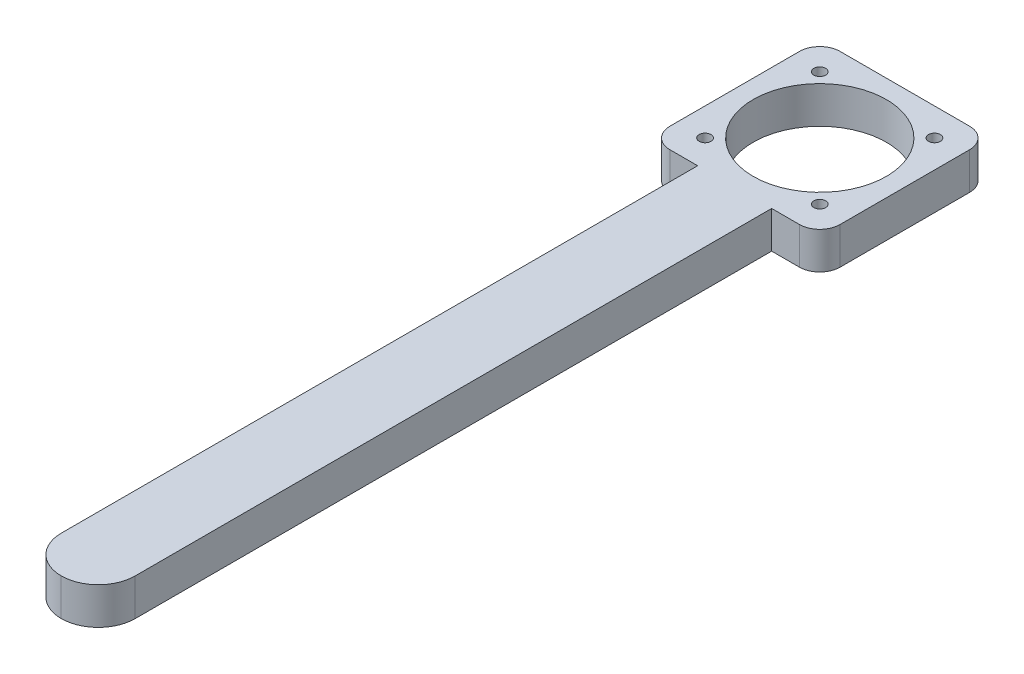
ISO-10303-21;
HEADER;
FILE_DESCRIPTION(('STEP AP214'),'2;1');
FILE_NAME('part.step','',(''),(''),'','','');
FILE_SCHEMA(('AUTOMOTIVE_DESIGN { 1 0 10303 214 1 1 1 1 }'));
ENDSEC;
DATA;
#1=APPLICATION_CONTEXT('core data for automotive mechanical design processes');
#2=APPLICATION_PROTOCOL_DEFINITION('international standard','automotive_design',2000,#1);
#3=PRODUCT_CONTEXT('',#1,'mechanical');
#4=PRODUCT('Part','Part','',(#3));
#5=PRODUCT_RELATED_PRODUCT_CATEGORY('part','',(#4));
#6=PRODUCT_DEFINITION_FORMATION('','',#4);
#7=PRODUCT_DEFINITION_CONTEXT('part definition',#1,'design');
#8=PRODUCT_DEFINITION('design','',#6,#7);
#9=PRODUCT_DEFINITION_SHAPE('','',#8);
#10=(LENGTH_UNIT() NAMED_UNIT(*) SI_UNIT(.MILLI.,.METRE.));
#11=(NAMED_UNIT(*) PLANE_ANGLE_UNIT() SI_UNIT($,.RADIAN.));
#12=(NAMED_UNIT(*) SI_UNIT($,.STERADIAN.) SOLID_ANGLE_UNIT());
#13=UNCERTAINTY_MEASURE_WITH_UNIT(LENGTH_MEASURE(1.E-05),#10,'distance_accuracy_value','');
#14=(GEOMETRIC_REPRESENTATION_CONTEXT(3) GLOBAL_UNCERTAINTY_ASSIGNED_CONTEXT((#13)) GLOBAL_UNIT_ASSIGNED_CONTEXT((#10,
#11,#12)) REPRESENTATION_CONTEXT('',''));
#15=CARTESIAN_POINT('',(0.,0.,0.));
#16=DIRECTION('',(0.,0.,1.));
#17=DIRECTION('',(1.,0.,0.));
#18=AXIS2_PLACEMENT_3D('',#15,#16,#17);
#19=CARTESIAN_POINT('',(-23.,10.,23.));
#20=DIRECTION('',(0.,0.,-1.));
#21=DIRECTION('',(-1.,0.,0.));
#22=AXIS2_PLACEMENT_3D('',#19,#20,#21);
#23=PLANE('',#22);
#24=DIRECTION('',(1.,0.,0.));
#25=VECTOR('',#24,1.);
#26=CARTESIAN_POINT('',(-23.,10.,23.));
#27=LINE('',#26,#25);
#28=CARTESIAN_POINT('',(10.,10.,23.));
#29=VERTEX_POINT('',#28);
#30=CARTESIAN_POINT('',(17.5,10.,23.));
#31=VERTEX_POINT('',#30);
#32=EDGE_CURVE('E249',#29,#31,#27,.T.);
#33=ORIENTED_EDGE('',*,*,#32,.F.);
#34=DIRECTION('',(0.,1.,0.));
#35=VECTOR('',#34,1.);
#36=CARTESIAN_POINT('',(10.,0.,23.));
#37=LINE('',#36,#35);
#38=CARTESIAN_POINT('',(10.,0.,23.));
#39=VERTEX_POINT('',#38);
#40=EDGE_CURVE('E154',#39,#29,#37,.T.);
#41=ORIENTED_EDGE('',*,*,#40,.F.);
#42=DIRECTION('',(1.,0.,0.));
#43=VECTOR('',#42,1.);
#44=CARTESIAN_POINT('',(-23.,0.,23.));
#45=LINE('',#44,#43);
#46=CARTESIAN_POINT('',(17.5,0.,23.));
#47=VERTEX_POINT('',#46);
#48=EDGE_CURVE('E171',#39,#47,#45,.T.);
#49=ORIENTED_EDGE('',*,*,#48,.T.);
#50=DIRECTION('',(0.,-1.,0.));
#51=VECTOR('',#50,1.);
#52=CARTESIAN_POINT('',(17.5,10.,23.));
#53=LINE('',#52,#51);
#54=EDGE_CURVE('E205',#47,#31,#53,.F.);
#55=ORIENTED_EDGE('',*,*,#54,.T.);
#56=EDGE_LOOP('',(#33,#41,#49,#55));
#57=FACE_BOUND('',#56,.T.);
#58=ADVANCED_FACE('F45',(#57),#23,.F.);
#59=CARTESIAN_POINT('',(0.,10.,0.));
#60=DIRECTION('',(0.,-1.,0.));
#61=DIRECTION('',(0.,0.,-1.));
#62=AXIS2_PLACEMENT_3D('',#59,#60,#61);
#63=PLANE('',#62);
#64=CARTESIAN_POINT('',(15.5,10.,15.5));
#65=DIRECTION('',(0.,1.,0.));
#66=DIRECTION('',(0.,0.,1.));
#67=AXIS2_PLACEMENT_3D('',#64,#65,#66);
#68=CIRCLE('',#67,1.6);
#69=CARTESIAN_POINT('',(15.5,10.,17.1));
#70=VERTEX_POINT('',#69);
#71=EDGE_CURVE('E373',#70,#70,#68,.T.);
#72=ORIENTED_EDGE('',*,*,#71,.F.);
#73=EDGE_LOOP('',(#72));
#74=FACE_BOUND('',#73,.T.);
#75=CARTESIAN_POINT('',(15.5,10.,-15.5));
#76=DIRECTION('',(0.,1.,0.));
#77=DIRECTION('',(0.,0.,1.));
#78=AXIS2_PLACEMENT_3D('',#75,#76,#77);
#79=CIRCLE('',#78,1.6);
#80=CARTESIAN_POINT('',(15.5,10.,-13.9));
#81=VERTEX_POINT('',#80);
#82=EDGE_CURVE('E379',#81,#81,#79,.T.);
#83=ORIENTED_EDGE('',*,*,#82,.F.);
#84=EDGE_LOOP('',(#83));
#85=FACE_BOUND('',#84,.T.);
#86=CARTESIAN_POINT('',(-15.5,10.,-15.5));
#87=DIRECTION('',(0.,1.,0.));
#88=DIRECTION('',(0.,0.,1.));
#89=AXIS2_PLACEMENT_3D('',#86,#87,#88);
#90=CIRCLE('',#89,1.6);
#91=CARTESIAN_POINT('',(-15.5,10.,-13.9));
#92=VERTEX_POINT('',#91);
#93=EDGE_CURVE('E365',#92,#92,#90,.T.);
#94=ORIENTED_EDGE('',*,*,#93,.F.);
#95=EDGE_LOOP('',(#94));
#96=FACE_BOUND('',#95,.T.);
#97=CARTESIAN_POINT('',(-15.5,10.,15.5));
#98=DIRECTION('',(0.,1.,0.));
#99=DIRECTION('',(0.,0.,1.));
#100=AXIS2_PLACEMENT_3D('',#97,#98,#99);
#101=CIRCLE('',#100,1.6);
#102=CARTESIAN_POINT('',(-15.5,10.,17.1));
#103=VERTEX_POINT('',#102);
#104=EDGE_CURVE('E359',#103,#103,#101,.T.);
#105=ORIENTED_EDGE('',*,*,#104,.F.);
#106=EDGE_LOOP('',(#105));
#107=FACE_BOUND('',#106,.T.);
#108=DIRECTION('',(0.,0.,1.));
#109=VECTOR('',#108,1.);
#110=CARTESIAN_POINT('',(-10.,10.,23.));
#111=LINE('',#110,#109);
#112=CARTESIAN_POINT('',(-10.,10.,23.));
#113=VERTEX_POINT('',#112);
#114=CARTESIAN_POINT('',(-10.,10.,195.));
#115=VERTEX_POINT('',#114);
#116=EDGE_CURVE('E148',#113,#115,#111,.T.);
#117=ORIENTED_EDGE('',*,*,#116,.T.);
#118=CARTESIAN_POINT('',(0.,10.,195.));
#119=DIRECTION('',(0.,-1.,0.));
#120=DIRECTION('',(0.,0.,-1.));
#121=AXIS2_PLACEMENT_3D('',#118,#119,#120);
#122=CIRCLE('',#121,10.);
#123=CARTESIAN_POINT('',(0.,10.,205.));
#124=VERTEX_POINT('',#123);
#125=EDGE_CURVE('E241',#115,#124,#122,.F.);
#126=ORIENTED_EDGE('',*,*,#125,.T.);
#127=CARTESIAN_POINT('',(0.,10.,195.));
#128=DIRECTION('',(0.,-1.,0.));
#129=DIRECTION('',(0.,0.,-1.));
#130=AXIS2_PLACEMENT_3D('',#127,#128,#129);
#131=CIRCLE('',#130,10.);
#132=CARTESIAN_POINT('',(10.,10.,195.));
#133=VERTEX_POINT('',#132);
#134=EDGE_CURVE('E238',#124,#133,#131,.F.);
#135=ORIENTED_EDGE('',*,*,#134,.T.);
#136=DIRECTION('',(0.,0.,-1.));
#137=VECTOR('',#136,1.);
#138=CARTESIAN_POINT('',(10.,10.,23.));
#139=LINE('',#138,#137);
#140=EDGE_CURVE('E163',#133,#29,#139,.T.);
#141=ORIENTED_EDGE('',*,*,#140,.T.);
#142=ORIENTED_EDGE('',*,*,#32,.T.);
#143=CARTESIAN_POINT('',(17.5,10.,17.5));
#144=DIRECTION('',(0.,-1.,0.));
#145=DIRECTION('',(0.,0.,-1.));
#146=AXIS2_PLACEMENT_3D('',#143,#144,#145);
#147=CIRCLE('',#146,5.5);
#148=CARTESIAN_POINT('',(23.,10.,17.5));
#149=VERTEX_POINT('',#148);
#150=EDGE_CURVE('E218',#31,#149,#147,.F.);
#151=ORIENTED_EDGE('',*,*,#150,.T.);
#152=DIRECTION('',(0.,0.,-1.));
#153=VECTOR('',#152,1.);
#154=CARTESIAN_POINT('',(23.,10.,23.));
#155=LINE('',#154,#153);
#156=CARTESIAN_POINT('',(23.,10.,-17.5));
#157=VERTEX_POINT('',#156);
#158=EDGE_CURVE('E170',#149,#157,#155,.T.);
#159=ORIENTED_EDGE('',*,*,#158,.T.);
#160=CARTESIAN_POINT('',(17.5,10.,-17.5));
#161=DIRECTION('',(0.,-1.,0.));
#162=DIRECTION('',(0.,0.,-1.));
#163=AXIS2_PLACEMENT_3D('',#160,#161,#162);
#164=CIRCLE('',#163,5.5);
#165=CARTESIAN_POINT('',(17.5,10.,-23.));
#166=VERTEX_POINT('',#165);
#167=EDGE_CURVE('E215',#157,#166,#164,.F.);
#168=ORIENTED_EDGE('',*,*,#167,.T.);
#169=DIRECTION('',(-1.,0.,0.));
#170=VECTOR('',#169,1.);
#171=CARTESIAN_POINT('',(-23.,10.,-23.));
#172=LINE('',#171,#170);
#173=CARTESIAN_POINT('',(-17.5,10.,-23.));
#174=VERTEX_POINT('',#173);
#175=EDGE_CURVE('E176',#166,#174,#172,.T.);
#176=ORIENTED_EDGE('',*,*,#175,.T.);
#177=CARTESIAN_POINT('',(-17.5,10.,-17.5));
#178=DIRECTION('',(0.,-1.,0.));
#179=DIRECTION('',(0.,0.,-1.));
#180=AXIS2_PLACEMENT_3D('',#177,#178,#179);
#181=CIRCLE('',#180,5.5);
#182=CARTESIAN_POINT('',(-23.,10.,-17.5));
#183=VERTEX_POINT('',#182);
#184=EDGE_CURVE('E212',#174,#183,#181,.F.);
#185=ORIENTED_EDGE('',*,*,#184,.T.);
#186=DIRECTION('',(0.,0.,1.));
#187=VECTOR('',#186,1.);
#188=CARTESIAN_POINT('',(-23.,10.,23.));
#189=LINE('',#188,#187);
#190=CARTESIAN_POINT('',(-23.,10.,17.5));
#191=VERTEX_POINT('',#190);
#192=EDGE_CURVE('E252',#183,#191,#189,.T.);
#193=ORIENTED_EDGE('',*,*,#192,.T.);
#194=CARTESIAN_POINT('',(-17.5,10.,17.5));
#195=DIRECTION('',(0.,-1.,0.));
#196=DIRECTION('',(0.,0.,-1.));
#197=AXIS2_PLACEMENT_3D('',#194,#195,#196);
#198=CIRCLE('',#197,5.5);
#199=CARTESIAN_POINT('',(-17.5,10.,23.));
#200=VERTEX_POINT('',#199);
#201=EDGE_CURVE('E209',#191,#200,#198,.F.);
#202=ORIENTED_EDGE('',*,*,#201,.T.);
#203=EDGE_CURVE('E186',#200,#113,#27,.T.);
#204=ORIENTED_EDGE('',*,*,#203,.T.);
#205=EDGE_LOOP('',(#117,#126,#135,#141,#142,#151,#159,#168,#176,#185,#193,#202,#204));
#206=FACE_BOUND('',#205,.T.);
#207=CARTESIAN_POINT('',(0.,10.,0.));
#208=DIRECTION('',(0.,1.,0.));
#209=DIRECTION('',(0.,0.,1.));
#210=AXIS2_PLACEMENT_3D('',#207,#208,#209);
#211=CIRCLE('',#210,18.);
#212=CARTESIAN_POINT('',(0.,10.,18.));
#213=VERTEX_POINT('',#212);
#214=EDGE_CURVE('E267',#213,#213,#211,.T.);
#215=ORIENTED_EDGE('',*,*,#214,.F.);
#216=EDGE_LOOP('',(#215));
#217=FACE_BOUND('',#216,.T.);
#218=ADVANCED_FACE('F284',(#74,#85,#96,#107,#206,#217),#63,.F.);
#219=CARTESIAN_POINT('',(0.,0.,0.));
#220=DIRECTION('',(0.,-1.,0.));
#221=DIRECTION('',(0.,0.,-1.));
#222=AXIS2_PLACEMENT_3D('',#219,#220,#221);
#223=PLANE('',#222);
#224=CARTESIAN_POINT('',(15.5,0.,15.5));
#225=DIRECTION('',(0.,1.,0.));
#226=DIRECTION('',(0.,0.,1.));
#227=AXIS2_PLACEMENT_3D('',#224,#225,#226);
#228=CIRCLE('',#227,1.6);
#229=CARTESIAN_POINT('',(15.5,0.,17.1));
#230=VERTEX_POINT('',#229);
#231=EDGE_CURVE('E344',#230,#230,#228,.T.);
#232=ORIENTED_EDGE('',*,*,#231,.T.);
#233=EDGE_LOOP('',(#232));
#234=FACE_BOUND('',#233,.T.);
#235=CARTESIAN_POINT('',(15.5,0.,-15.5));
#236=DIRECTION('',(0.,1.,0.));
#237=DIRECTION('',(0.,0.,1.));
#238=AXIS2_PLACEMENT_3D('',#235,#236,#237);
#239=CIRCLE('',#238,1.6);
#240=CARTESIAN_POINT('',(15.5,0.,-13.9));
#241=VERTEX_POINT('',#240);
#242=EDGE_CURVE('E348',#241,#241,#239,.T.);
#243=ORIENTED_EDGE('',*,*,#242,.T.);
#244=EDGE_LOOP('',(#243));
#245=FACE_BOUND('',#244,.T.);
#246=CARTESIAN_POINT('',(-15.5,0.,-15.5));
#247=DIRECTION('',(0.,1.,0.));
#248=DIRECTION('',(0.,0.,1.));
#249=AXIS2_PLACEMENT_3D('',#246,#247,#248);
#250=CIRCLE('',#249,1.6);
#251=CARTESIAN_POINT('',(-15.5,0.,-13.9));
#252=VERTEX_POINT('',#251);
#253=EDGE_CURVE('E352',#252,#252,#250,.T.);
#254=ORIENTED_EDGE('',*,*,#253,.T.);
#255=EDGE_LOOP('',(#254));
#256=FACE_BOUND('',#255,.T.);
#257=CARTESIAN_POINT('',(-15.5,0.,15.5));
#258=DIRECTION('',(0.,1.,0.));
#259=DIRECTION('',(0.,0.,1.));
#260=AXIS2_PLACEMENT_3D('',#257,#258,#259);
#261=CIRCLE('',#260,1.6);
#262=CARTESIAN_POINT('',(-15.5,0.,17.1));
#263=VERTEX_POINT('',#262);
#264=EDGE_CURVE('E355',#263,#263,#261,.T.);
#265=ORIENTED_EDGE('',*,*,#264,.T.);
#266=EDGE_LOOP('',(#265));
#267=FACE_BOUND('',#266,.T.);
#268=CARTESIAN_POINT('',(0.,0.,195.));
#269=DIRECTION('',(0.,-1.,0.));
#270=DIRECTION('',(0.,0.,-1.));
#271=AXIS2_PLACEMENT_3D('',#268,#269,#270);
#272=CIRCLE('',#271,10.);
#273=CARTESIAN_POINT('',(10.,0.,195.));
#274=VERTEX_POINT('',#273);
#275=CARTESIAN_POINT('',(0.,0.,205.));
#276=VERTEX_POINT('',#275);
#277=EDGE_CURVE('E62',#274,#276,#272,.T.);
#278=ORIENTED_EDGE('',*,*,#277,.T.);
#279=CARTESIAN_POINT('',(0.,0.,195.));
#280=DIRECTION('',(0.,-1.,0.));
#281=DIRECTION('',(0.,0.,-1.));
#282=AXIS2_PLACEMENT_3D('',#279,#280,#281);
#283=CIRCLE('',#282,10.);
#284=CARTESIAN_POINT('',(-10.,0.,195.));
#285=VERTEX_POINT('',#284);
#286=EDGE_CURVE('E55',#276,#285,#283,.T.);
#287=ORIENTED_EDGE('',*,*,#286,.T.);
#288=DIRECTION('',(0.,0.,1.));
#289=VECTOR('',#288,1.);
#290=CARTESIAN_POINT('',(-10.,0.,23.));
#291=LINE('',#290,#289);
#292=CARTESIAN_POINT('',(-10.,0.,23.));
#293=VERTEX_POINT('',#292);
#294=EDGE_CURVE('E145',#293,#285,#291,.T.);
#295=ORIENTED_EDGE('',*,*,#294,.F.);
#296=CARTESIAN_POINT('',(-17.5,0.,23.));
#297=VERTEX_POINT('',#296);
#298=EDGE_CURVE('E160',#297,#293,#45,.T.);
#299=ORIENTED_EDGE('',*,*,#298,.F.);
#300=CARTESIAN_POINT('',(-17.5,0.,17.5));
#301=DIRECTION('',(0.,-1.,0.));
#302=DIRECTION('',(0.,0.,-1.));
#303=AXIS2_PLACEMENT_3D('',#300,#301,#302);
#304=CIRCLE('',#303,5.5);
#305=CARTESIAN_POINT('',(-23.,0.,17.5));
#306=VERTEX_POINT('',#305);
#307=EDGE_CURVE('E190',#297,#306,#304,.T.);
#308=ORIENTED_EDGE('',*,*,#307,.T.);
#309=DIRECTION('',(0.,0.,1.));
#310=VECTOR('',#309,1.);
#311=CARTESIAN_POINT('',(-23.,0.,23.));
#312=LINE('',#311,#310);
#313=CARTESIAN_POINT('',(-23.,0.,-17.5));
#314=VERTEX_POINT('',#313);
#315=EDGE_CURVE('E178',#314,#306,#312,.T.);
#316=ORIENTED_EDGE('',*,*,#315,.F.);
#317=CARTESIAN_POINT('',(-17.5,0.,-17.5));
#318=DIRECTION('',(0.,-1.,0.));
#319=DIRECTION('',(0.,0.,-1.));
#320=AXIS2_PLACEMENT_3D('',#317,#318,#319);
#321=CIRCLE('',#320,5.5);
#322=CARTESIAN_POINT('',(-17.5,0.,-23.));
#323=VERTEX_POINT('',#322);
#324=EDGE_CURVE('E193',#314,#323,#321,.T.);
#325=ORIENTED_EDGE('',*,*,#324,.T.);
#326=DIRECTION('',(-1.,0.,0.));
#327=VECTOR('',#326,1.);
#328=CARTESIAN_POINT('',(-23.,0.,-23.));
#329=LINE('',#328,#327);
#330=CARTESIAN_POINT('',(17.5,0.,-23.));
#331=VERTEX_POINT('',#330);
#332=EDGE_CURVE('E266',#331,#323,#329,.T.);
#333=ORIENTED_EDGE('',*,*,#332,.F.);
#334=CARTESIAN_POINT('',(17.5,0.,-17.5));
#335=DIRECTION('',(0.,-1.,0.));
#336=DIRECTION('',(0.,0.,-1.));
#337=AXIS2_PLACEMENT_3D('',#334,#335,#336);
#338=CIRCLE('',#337,5.5);
#339=CARTESIAN_POINT('',(23.,0.,-17.5));
#340=VERTEX_POINT('',#339);
#341=EDGE_CURVE('E196',#331,#340,#338,.T.);
#342=ORIENTED_EDGE('',*,*,#341,.T.);
#343=DIRECTION('',(0.,0.,-1.));
#344=VECTOR('',#343,1.);
#345=CARTESIAN_POINT('',(23.,0.,23.));
#346=LINE('',#345,#344);
#347=CARTESIAN_POINT('',(23.,0.,17.5));
#348=VERTEX_POINT('',#347);
#349=EDGE_CURVE('E263',#348,#340,#346,.T.);
#350=ORIENTED_EDGE('',*,*,#349,.F.);
#351=CARTESIAN_POINT('',(17.5,0.,17.5));
#352=DIRECTION('',(0.,-1.,0.));
#353=DIRECTION('',(0.,0.,-1.));
#354=AXIS2_PLACEMENT_3D('',#351,#352,#353);
#355=CIRCLE('',#354,5.5);
#356=EDGE_CURVE('E199',#348,#47,#355,.T.);
#357=ORIENTED_EDGE('',*,*,#356,.T.);
#358=ORIENTED_EDGE('',*,*,#48,.F.);
#359=DIRECTION('',(0.,0.,-1.));
#360=VECTOR('',#359,1.);
#361=CARTESIAN_POINT('',(10.,0.,23.));
#362=LINE('',#361,#360);
#363=EDGE_CURVE('E155',#274,#39,#362,.T.);
#364=ORIENTED_EDGE('',*,*,#363,.F.);
#365=EDGE_LOOP('',(#278,#287,#295,#299,#308,#316,#325,#333,#342,#350,#357,#358,#364));
#366=FACE_BOUND('',#365,.T.);
#367=CARTESIAN_POINT('',(0.,0.,0.));
#368=DIRECTION('',(0.,1.,0.));
#369=DIRECTION('',(0.,0.,1.));
#370=AXIS2_PLACEMENT_3D('',#367,#368,#369);
#371=CIRCLE('',#370,18.);
#372=CARTESIAN_POINT('',(0.,0.,18.));
#373=VERTEX_POINT('',#372);
#374=EDGE_CURVE('E358',#373,#373,#371,.T.);
#375=ORIENTED_EDGE('',*,*,#374,.T.);
#376=EDGE_LOOP('',(#375));
#377=FACE_BOUND('',#376,.T.);
#378=ADVANCED_FACE('F158',(#234,#245,#256,#267,#366,#377),#223,.T.);
#379=CARTESIAN_POINT('',(23.,10.,23.));
#380=DIRECTION('',(-1.,0.,0.));
#381=DIRECTION('',(0.,0.,1.));
#382=AXIS2_PLACEMENT_3D('',#379,#380,#381);
#383=PLANE('',#382);
#384=ORIENTED_EDGE('',*,*,#158,.F.);
#385=DIRECTION('',(0.,-1.,0.));
#386=VECTOR('',#385,1.);
#387=CARTESIAN_POINT('',(23.,10.,17.5));
#388=LINE('',#387,#386);
#389=EDGE_CURVE('E185',#149,#348,#388,.T.);
#390=ORIENTED_EDGE('',*,*,#389,.T.);
#391=ORIENTED_EDGE('',*,*,#349,.T.);
#392=DIRECTION('',(0.,-1.,0.));
#393=VECTOR('',#392,1.);
#394=CARTESIAN_POINT('',(23.,10.,-17.5));
#395=LINE('',#394,#393);
#396=EDGE_CURVE('E182',#340,#157,#395,.F.);
#397=ORIENTED_EDGE('',*,*,#396,.T.);
#398=EDGE_LOOP('',(#384,#390,#391,#397));
#399=FACE_BOUND('',#398,.T.);
#400=ADVANCED_FACE('F294',(#399),#383,.F.);
#401=CARTESIAN_POINT('',(-23.,10.,-23.));
#402=DIRECTION('',(0.,0.,1.));
#403=DIRECTION('',(1.,0.,0.));
#404=AXIS2_PLACEMENT_3D('',#401,#402,#403);
#405=PLANE('',#404);
#406=ORIENTED_EDGE('',*,*,#175,.F.);
#407=DIRECTION('',(0.,-1.,0.));
#408=VECTOR('',#407,1.);
#409=CARTESIAN_POINT('',(17.5,10.,-23.));
#410=LINE('',#409,#408);
#411=EDGE_CURVE('E224',#166,#331,#410,.T.);
#412=ORIENTED_EDGE('',*,*,#411,.T.);
#413=ORIENTED_EDGE('',*,*,#332,.T.);
#414=DIRECTION('',(0.,-1.,0.));
#415=VECTOR('',#414,1.);
#416=CARTESIAN_POINT('',(-17.5,10.,-23.));
#417=LINE('',#416,#415);
#418=EDGE_CURVE('E221',#323,#174,#417,.F.);
#419=ORIENTED_EDGE('',*,*,#418,.T.);
#420=EDGE_LOOP('',(#406,#412,#413,#419));
#421=FACE_BOUND('',#420,.T.);
#422=ADVANCED_FACE('F298',(#421),#405,.F.);
#423=CARTESIAN_POINT('',(-23.,10.,23.));
#424=DIRECTION('',(1.,0.,0.));
#425=DIRECTION('',(0.,0.,-1.));
#426=AXIS2_PLACEMENT_3D('',#423,#424,#425);
#427=PLANE('',#426);
#428=ORIENTED_EDGE('',*,*,#192,.F.);
#429=DIRECTION('',(0.,-1.,0.));
#430=VECTOR('',#429,1.);
#431=CARTESIAN_POINT('',(-23.,10.,-17.5));
#432=LINE('',#431,#430);
#433=EDGE_CURVE('E231',#183,#314,#432,.T.);
#434=ORIENTED_EDGE('',*,*,#433,.T.);
#435=ORIENTED_EDGE('',*,*,#315,.T.);
#436=DIRECTION('',(0.,-1.,0.));
#437=VECTOR('',#436,1.);
#438=CARTESIAN_POINT('',(-23.,10.,17.5));
#439=LINE('',#438,#437);
#440=EDGE_CURVE('E228',#306,#191,#439,.F.);
#441=ORIENTED_EDGE('',*,*,#440,.T.);
#442=EDGE_LOOP('',(#428,#434,#435,#441));
#443=FACE_BOUND('',#442,.T.);
#444=ADVANCED_FACE('F279',(#443),#427,.F.);
#445=ORIENTED_EDGE('',*,*,#298,.T.);
#446=DIRECTION('',(0.,1.,0.));
#447=VECTOR('',#446,1.);
#448=CARTESIAN_POINT('',(-10.,0.,23.));
#449=LINE('',#448,#447);
#450=EDGE_CURVE('E141',#293,#113,#449,.T.);
#451=ORIENTED_EDGE('',*,*,#450,.T.);
#452=ORIENTED_EDGE('',*,*,#203,.F.);
#453=DIRECTION('',(0.,-1.,0.));
#454=VECTOR('',#453,1.);
#455=CARTESIAN_POINT('',(-17.5,10.,23.));
#456=LINE('',#455,#454);
#457=EDGE_CURVE('E168',#200,#297,#456,.T.);
#458=ORIENTED_EDGE('',*,*,#457,.T.);
#459=EDGE_LOOP('',(#445,#451,#452,#458));
#460=FACE_BOUND('',#459,.T.);
#461=ADVANCED_FACE('F166',(#460),#23,.F.);
#462=CARTESIAN_POINT('',(0.,10.,0.));
#463=DIRECTION('',(0.,-1.,0.));
#464=DIRECTION('',(0.,0.,-1.));
#465=AXIS2_PLACEMENT_3D('',#462,#463,#464);
#466=CYLINDRICAL_SURFACE('',#465,18.);
#467=ORIENTED_EDGE('',*,*,#214,.T.);
#468=EDGE_LOOP('',(#467));
#469=FACE_BOUND('',#468,.T.);
#470=ORIENTED_EDGE('',*,*,#374,.F.);
#471=EDGE_LOOP('',(#470));
#472=FACE_BOUND('',#471,.T.);
#473=ADVANCED_FACE('F319',(#469,#472),#466,.F.);
#474=CARTESIAN_POINT('',(17.5,10.,17.5));
#475=DIRECTION('',(0.,-1.,0.));
#476=DIRECTION('',(0.,0.,-1.));
#477=AXIS2_PLACEMENT_3D('',#474,#475,#476);
#478=CYLINDRICAL_SURFACE('',#477,5.5);
#479=ORIENTED_EDGE('',*,*,#150,.F.);
#480=ORIENTED_EDGE('',*,*,#54,.F.);
#481=ORIENTED_EDGE('',*,*,#356,.F.);
#482=ORIENTED_EDGE('',*,*,#389,.F.);
#483=EDGE_LOOP('',(#479,#480,#481,#482));
#484=FACE_BOUND('',#483,.T.);
#485=ADVANCED_FACE('F323',(#484),#478,.T.);
#486=CARTESIAN_POINT('',(17.5,10.,-17.5));
#487=DIRECTION('',(0.,-1.,0.));
#488=DIRECTION('',(0.,0.,-1.));
#489=AXIS2_PLACEMENT_3D('',#486,#487,#488);
#490=CYLINDRICAL_SURFACE('',#489,5.5);
#491=ORIENTED_EDGE('',*,*,#167,.F.);
#492=ORIENTED_EDGE('',*,*,#396,.F.);
#493=ORIENTED_EDGE('',*,*,#341,.F.);
#494=ORIENTED_EDGE('',*,*,#411,.F.);
#495=EDGE_LOOP('',(#491,#492,#493,#494));
#496=FACE_BOUND('',#495,.T.);
#497=ADVANCED_FACE('F297',(#496),#490,.T.);
#498=CARTESIAN_POINT('',(-17.5,10.,-17.5));
#499=DIRECTION('',(0.,-1.,0.));
#500=DIRECTION('',(0.,0.,-1.));
#501=AXIS2_PLACEMENT_3D('',#498,#499,#500);
#502=CYLINDRICAL_SURFACE('',#501,5.5);
#503=ORIENTED_EDGE('',*,*,#184,.F.);
#504=ORIENTED_EDGE('',*,*,#418,.F.);
#505=ORIENTED_EDGE('',*,*,#324,.F.);
#506=ORIENTED_EDGE('',*,*,#433,.F.);
#507=EDGE_LOOP('',(#503,#504,#505,#506));
#508=FACE_BOUND('',#507,.T.);
#509=ADVANCED_FACE('F287',(#508),#502,.T.);
#510=CARTESIAN_POINT('',(-17.5,10.,17.5));
#511=DIRECTION('',(0.,-1.,0.));
#512=DIRECTION('',(0.,0.,-1.));
#513=AXIS2_PLACEMENT_3D('',#510,#511,#512);
#514=CYLINDRICAL_SURFACE('',#513,5.5);
#515=ORIENTED_EDGE('',*,*,#201,.F.);
#516=ORIENTED_EDGE('',*,*,#440,.F.);
#517=ORIENTED_EDGE('',*,*,#307,.F.);
#518=ORIENTED_EDGE('',*,*,#457,.F.);
#519=EDGE_LOOP('',(#515,#516,#517,#518));
#520=FACE_BOUND('',#519,.T.);
#521=ADVANCED_FACE('F283',(#520),#514,.T.);
#522=CARTESIAN_POINT('',(-15.5,0.,15.5));
#523=DIRECTION('',(0.,1.,0.));
#524=DIRECTION('',(0.,0.,1.));
#525=AXIS2_PLACEMENT_3D('',#522,#523,#524);
#526=CYLINDRICAL_SURFACE('',#525,1.6);
#527=ORIENTED_EDGE('',*,*,#264,.F.);
#528=EDGE_LOOP('',(#527));
#529=FACE_BOUND('',#528,.T.);
#530=ORIENTED_EDGE('',*,*,#104,.T.);
#531=EDGE_LOOP('',(#530));
#532=FACE_BOUND('',#531,.T.);
#533=ADVANCED_FACE('F334',(#529,#532),#526,.F.);
#534=CARTESIAN_POINT('',(-15.5,0.,-15.5));
#535=DIRECTION('',(0.,1.,0.));
#536=DIRECTION('',(0.,0.,1.));
#537=AXIS2_PLACEMENT_3D('',#534,#535,#536);
#538=CYLINDRICAL_SURFACE('',#537,1.6);
#539=ORIENTED_EDGE('',*,*,#253,.F.);
#540=EDGE_LOOP('',(#539));
#541=FACE_BOUND('',#540,.T.);
#542=ORIENTED_EDGE('',*,*,#93,.T.);
#543=EDGE_LOOP('',(#542));
#544=FACE_BOUND('',#543,.T.);
#545=ADVANCED_FACE('F438',(#541,#544),#538,.F.);
#546=CARTESIAN_POINT('',(15.5,0.,-15.5));
#547=DIRECTION('',(0.,1.,0.));
#548=DIRECTION('',(0.,0.,1.));
#549=AXIS2_PLACEMENT_3D('',#546,#547,#548);
#550=CYLINDRICAL_SURFACE('',#549,1.6);
#551=ORIENTED_EDGE('',*,*,#242,.F.);
#552=EDGE_LOOP('',(#551));
#553=FACE_BOUND('',#552,.T.);
#554=ORIENTED_EDGE('',*,*,#82,.T.);
#555=EDGE_LOOP('',(#554));
#556=FACE_BOUND('',#555,.T.);
#557=ADVANCED_FACE('F445',(#553,#556),#550,.F.);
#558=CARTESIAN_POINT('',(15.5,0.,15.5));
#559=DIRECTION('',(0.,1.,0.));
#560=DIRECTION('',(0.,0.,1.));
#561=AXIS2_PLACEMENT_3D('',#558,#559,#560);
#562=CYLINDRICAL_SURFACE('',#561,1.6);
#563=ORIENTED_EDGE('',*,*,#231,.F.);
#564=EDGE_LOOP('',(#563));
#565=FACE_BOUND('',#564,.T.);
#566=ORIENTED_EDGE('',*,*,#71,.T.);
#567=EDGE_LOOP('',(#566));
#568=FACE_BOUND('',#567,.T.);
#569=ADVANCED_FACE('F453',(#565,#568),#562,.F.);
#570=CARTESIAN_POINT('',(10.,0.,23.));
#571=DIRECTION('',(1.,0.,0.));
#572=DIRECTION('',(0.,0.,-1.));
#573=AXIS2_PLACEMENT_3D('',#570,#571,#572);
#574=PLANE('',#573);
#575=ORIENTED_EDGE('',*,*,#140,.F.);
#576=DIRECTION('',(0.,1.,0.));
#577=VECTOR('',#576,1.);
#578=CARTESIAN_POINT('',(10.,0.,195.));
#579=LINE('',#578,#577);
#580=EDGE_CURVE('E11',#133,#274,#579,.F.);
#581=ORIENTED_EDGE('',*,*,#580,.T.);
#582=ORIENTED_EDGE('',*,*,#363,.T.);
#583=ORIENTED_EDGE('',*,*,#40,.T.);
#584=EDGE_LOOP('',(#575,#581,#582,#583));
#585=FACE_BOUND('',#584,.T.);
#586=ADVANCED_FACE('F397',(#585),#574,.T.);
#587=CARTESIAN_POINT('',(-10.,0.,23.));
#588=DIRECTION('',(-1.,0.,0.));
#589=DIRECTION('',(0.,0.,1.));
#590=AXIS2_PLACEMENT_3D('',#587,#588,#589);
#591=PLANE('',#590);
#592=ORIENTED_EDGE('',*,*,#294,.T.);
#593=DIRECTION('',(0.,1.,0.));
#594=VECTOR('',#593,1.);
#595=CARTESIAN_POINT('',(-10.,0.,195.));
#596=LINE('',#595,#594);
#597=EDGE_CURVE('E235',#285,#115,#596,.T.);
#598=ORIENTED_EDGE('',*,*,#597,.T.);
#599=ORIENTED_EDGE('',*,*,#116,.F.);
#600=ORIENTED_EDGE('',*,*,#450,.F.);
#601=EDGE_LOOP('',(#592,#598,#599,#600));
#602=FACE_BOUND('',#601,.T.);
#603=ADVANCED_FACE('F143',(#602),#591,.T.);
#604=CARTESIAN_POINT('',(0.,0.,195.));
#605=DIRECTION('',(0.,1.,0.));
#606=DIRECTION('',(0.,0.,1.));
#607=AXIS2_PLACEMENT_3D('',#604,#605,#606);
#608=CYLINDRICAL_SURFACE('',#607,10.);
#609=DIRECTION('',(0.,1.,0.));
#610=VECTOR('',#609,1.);
#611=CARTESIAN_POINT('',(0.,0.,205.));
#612=LINE('',#611,#610);
#613=EDGE_CURVE('E49',#276,#124,#612,.T.);
#614=ORIENTED_EDGE('',*,*,#613,.F.);
#615=ORIENTED_EDGE('',*,*,#277,.F.);
#616=ORIENTED_EDGE('',*,*,#580,.F.);
#617=ORIENTED_EDGE('',*,*,#134,.F.);
#618=EDGE_LOOP('',(#614,#615,#616,#617));
#619=FACE_BOUND('',#618,.T.);
#620=ADVANCED_FACE('F47',(#619),#608,.T.);
#621=CARTESIAN_POINT('',(0.,0.,195.));
#622=DIRECTION('',(0.,1.,0.));
#623=DIRECTION('',(0.,0.,1.));
#624=AXIS2_PLACEMENT_3D('',#621,#622,#623);
#625=CYLINDRICAL_SURFACE('',#624,10.);
#626=ORIENTED_EDGE('',*,*,#286,.F.);
#627=ORIENTED_EDGE('',*,*,#613,.T.);
#628=ORIENTED_EDGE('',*,*,#125,.F.);
#629=ORIENTED_EDGE('',*,*,#597,.F.);
#630=EDGE_LOOP('',(#626,#627,#628,#629));
#631=FACE_BOUND('',#630,.T.);
#632=ADVANCED_FACE('F406',(#631),#625,.T.);
#633=CLOSED_SHELL('',(#58,#218,#378,#400,#422,#444,#461,#473,#485,#497,#509,#521,#533,#545,#557,
#569,#586,#603,#620,#632));
#634=MANIFOLD_SOLID_BREP('B2',#633);
#635=ADVANCED_BREP_SHAPE_REPRESENTATION('',(#18,#634),#14);
#636=SHAPE_DEFINITION_REPRESENTATION(#9,#635);
ENDSEC;
END-ISO-10303-21;
